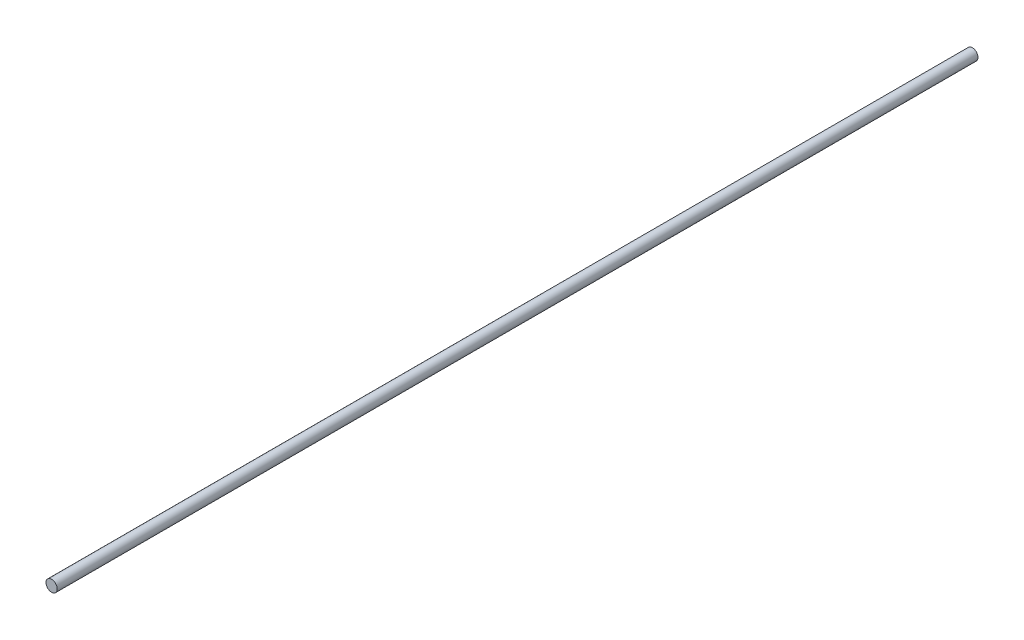
ISO-10303-21;
HEADER;
FILE_DESCRIPTION(('STEP AP214'),'2;1');
FILE_NAME('part.step','',(''),(''),'','','');
FILE_SCHEMA(('AUTOMOTIVE_DESIGN { 1 0 10303 214 1 1 1 1 }'));
ENDSEC;
DATA;
#1=APPLICATION_CONTEXT('core data for automotive mechanical design processes');
#2=APPLICATION_PROTOCOL_DEFINITION('international standard','automotive_design',2000,#1);
#3=PRODUCT_CONTEXT('',#1,'mechanical');
#4=PRODUCT('Part','Part','',(#3));
#5=PRODUCT_RELATED_PRODUCT_CATEGORY('part','',(#4));
#6=PRODUCT_DEFINITION_FORMATION('','',#4);
#7=PRODUCT_DEFINITION_CONTEXT('part definition',#1,'design');
#8=PRODUCT_DEFINITION('design','',#6,#7);
#9=PRODUCT_DEFINITION_SHAPE('','',#8);
#10=(LENGTH_UNIT() NAMED_UNIT(*) SI_UNIT(.MILLI.,.METRE.));
#11=(NAMED_UNIT(*) PLANE_ANGLE_UNIT() SI_UNIT($,.RADIAN.));
#12=(NAMED_UNIT(*) SI_UNIT($,.STERADIAN.) SOLID_ANGLE_UNIT());
#13=UNCERTAINTY_MEASURE_WITH_UNIT(LENGTH_MEASURE(1.E-05),#10,'distance_accuracy_value','');
#14=(GEOMETRIC_REPRESENTATION_CONTEXT(3) GLOBAL_UNCERTAINTY_ASSIGNED_CONTEXT((#13)) GLOBAL_UNIT_ASSIGNED_CONTEXT((#10,
#11,#12)) REPRESENTATION_CONTEXT('',''));
#15=CARTESIAN_POINT('',(0.,0.,0.));
#16=DIRECTION('',(0.,0.,1.));
#17=DIRECTION('',(1.,0.,0.));
#18=AXIS2_PLACEMENT_3D('',#15,#16,#17);
#19=CARTESIAN_POINT('',(0.,0.,-655.));
#20=DIRECTION('',(0.,0.,1.));
#21=DIRECTION('',(1.,0.,0.));
#22=AXIS2_PLACEMENT_3D('',#19,#20,#21);
#23=CYLINDRICAL_SURFACE('',#22,4.);
#24=CARTESIAN_POINT('',(0.,0.,-655.));
#25=DIRECTION('',(0.,0.,1.));
#26=DIRECTION('',(1.,0.,0.));
#27=AXIS2_PLACEMENT_3D('',#24,#25,#26);
#28=CIRCLE('',#27,4.);
#29=CARTESIAN_POINT('',(4.,0.,-655.));
#30=VERTEX_POINT('',#29);
#31=EDGE_CURVE('E10',#30,#30,#28,.T.);
#32=ORIENTED_EDGE('',*,*,#31,.T.);
#33=EDGE_LOOP('',(#32));
#34=FACE_BOUND('',#33,.T.);
#35=CARTESIAN_POINT('',(0.,0.,0.));
#36=DIRECTION('',(0.,0.,1.));
#37=DIRECTION('',(1.,0.,0.));
#38=AXIS2_PLACEMENT_3D('',#35,#36,#37);
#39=CIRCLE('',#38,4.);
#40=CARTESIAN_POINT('',(4.,0.,0.));
#41=VERTEX_POINT('',#40);
#42=EDGE_CURVE('E34',#41,#41,#39,.T.);
#43=ORIENTED_EDGE('',*,*,#42,.F.);
#44=EDGE_LOOP('',(#43));
#45=FACE_BOUND('',#44,.T.);
#46=ADVANCED_FACE('F31',(#34,#45),#23,.T.);
#47=CARTESIAN_POINT('',(0.,0.,-655.));
#48=DIRECTION('',(0.,0.,1.));
#49=DIRECTION('',(1.,0.,0.));
#50=AXIS2_PLACEMENT_3D('',#47,#48,#49);
#51=PLANE('',#50);
#52=ORIENTED_EDGE('',*,*,#31,.F.);
#53=EDGE_LOOP('',(#52));
#54=FACE_BOUND('',#53,.T.);
#55=ADVANCED_FACE('F46',(#54),#51,.F.);
#56=CARTESIAN_POINT('',(0.,0.,0.));
#57=DIRECTION('',(0.,0.,1.));
#58=DIRECTION('',(1.,0.,0.));
#59=AXIS2_PLACEMENT_3D('',#56,#57,#58);
#60=PLANE('',#59);
#61=ORIENTED_EDGE('',*,*,#42,.T.);
#62=EDGE_LOOP('',(#61));
#63=FACE_BOUND('',#62,.T.);
#64=ADVANCED_FACE('F43',(#63),#60,.T.);
#65=CLOSED_SHELL('',(#46,#55,#64));
#66=MANIFOLD_SOLID_BREP('B2',#65);
#67=ADVANCED_BREP_SHAPE_REPRESENTATION('',(#18,#66),#14);
#68=SHAPE_DEFINITION_REPRESENTATION(#9,#67);
ENDSEC;
END-ISO-10303-21;
